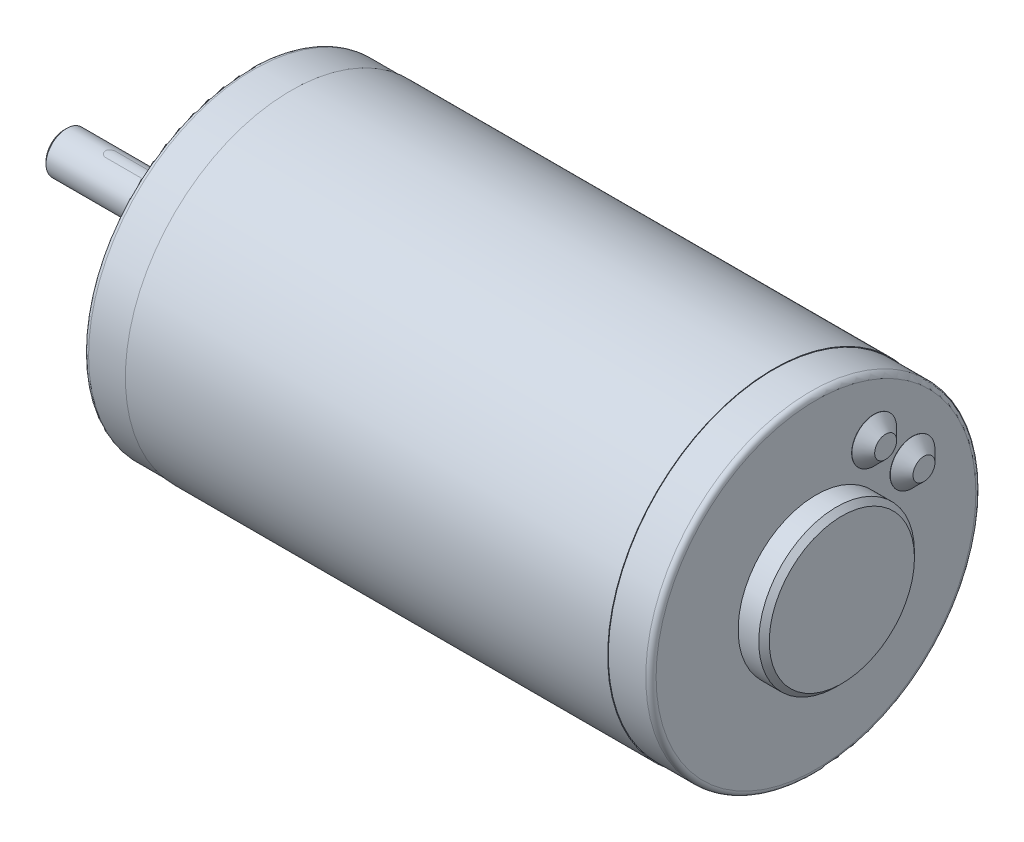
ISO-10303-21;
HEADER;
FILE_DESCRIPTION(('STEP AP214'),'2;1');
FILE_NAME('part.step','',(''),(''),'','','');
FILE_SCHEMA(('AUTOMOTIVE_DESIGN { 1 0 10303 214 1 1 1 1 }'));
ENDSEC;
DATA;
#1=APPLICATION_CONTEXT('core data for automotive mechanical design processes');
#2=APPLICATION_PROTOCOL_DEFINITION('international standard','automotive_design',2000,#1);
#3=PRODUCT_CONTEXT('',#1,'mechanical');
#4=PRODUCT('Part','Part','',(#3));
#5=PRODUCT_RELATED_PRODUCT_CATEGORY('part','',(#4));
#6=PRODUCT_DEFINITION_FORMATION('','',#4);
#7=PRODUCT_DEFINITION_CONTEXT('part definition',#1,'design');
#8=PRODUCT_DEFINITION('design','',#6,#7);
#9=PRODUCT_DEFINITION_SHAPE('','',#8);
#10=(LENGTH_UNIT() NAMED_UNIT(*) SI_UNIT(.MILLI.,.METRE.));
#11=(NAMED_UNIT(*) PLANE_ANGLE_UNIT() SI_UNIT($,.RADIAN.));
#12=(NAMED_UNIT(*) SI_UNIT($,.STERADIAN.) SOLID_ANGLE_UNIT());
#13=UNCERTAINTY_MEASURE_WITH_UNIT(LENGTH_MEASURE(1.E-05),#10,'distance_accuracy_value','');
#14=(GEOMETRIC_REPRESENTATION_CONTEXT(3) GLOBAL_UNCERTAINTY_ASSIGNED_CONTEXT((#13)) GLOBAL_UNIT_ASSIGNED_CONTEXT((#10,
#11,#12)) REPRESENTATION_CONTEXT('',''));
#15=CARTESIAN_POINT('',(0.,0.,0.));
#16=DIRECTION('',(0.,0.,1.));
#17=DIRECTION('',(1.,0.,0.));
#18=AXIS2_PLACEMENT_3D('',#15,#16,#17);
#19=CARTESIAN_POINT('',(-4.,0.,0.));
#20=DIRECTION('',(-1.,0.,0.));
#21=DIRECTION('',(0.,0.,1.));
#22=AXIS2_PLACEMENT_3D('',#19,#20,#21);
#23=PLANE('',#22);
#24=CARTESIAN_POINT('',(-4.,0.,0.));
#25=DIRECTION('',(-1.,0.,0.));
#26=DIRECTION('',(0.,0.,1.));
#27=AXIS2_PLACEMENT_3D('',#24,#25,#26);
#28=CIRCLE('',#27,8.50900000000004);
#29=CARTESIAN_POINT('',(-4.,0.,8.50900000000004));
#30=VERTEX_POINT('',#29);
#31=EDGE_CURVE('P0_E195',#30,#30,#28,.T.);
#32=ORIENTED_EDGE('',*,*,#31,.T.);
#33=EDGE_LOOP('',(#32));
#34=FACE_BOUND('',#33,.T.);
#35=CARTESIAN_POINT('',(-4.,0.,0.));
#36=DIRECTION('',(-1.,0.,0.));
#37=DIRECTION('',(0.,0.,1.));
#38=AXIS2_PLACEMENT_3D('',#35,#36,#37);
#39=CIRCLE('',#38,4.);
#40=CARTESIAN_POINT('',(-4.,0.,4.));
#41=VERTEX_POINT('',#40);
#42=EDGE_CURVE('P0_E121',#41,#41,#39,.T.);
#43=ORIENTED_EDGE('',*,*,#42,.F.);
#44=EDGE_LOOP('',(#43));
#45=FACE_BOUND('',#44,.T.);
#46=ADVANCED_FACE('P0_F38',(#34,#45),#23,.T.);
#47=CARTESIAN_POINT('',(0.,0.,0.));
#48=DIRECTION('',(-1.,0.,0.));
#49=DIRECTION('',(0.,0.,1.));
#50=AXIS2_PLACEMENT_3D('',#47,#48,#49);
#51=PLANE('',#50);
#52=CARTESIAN_POINT('',(0.,0.,0.));
#53=DIRECTION('',(-1.,0.,0.));
#54=DIRECTION('',(0.,0.,1.));
#55=AXIS2_PLACEMENT_3D('',#52,#53,#54);
#56=CIRCLE('',#55,30.877);
#57=CARTESIAN_POINT('',(0.,0.,30.877));
#58=VERTEX_POINT('',#57);
#59=EDGE_CURVE('P0_E46',#58,#58,#56,.T.);
#60=ORIENTED_EDGE('',*,*,#59,.T.);
#61=EDGE_LOOP('',(#60));
#62=FACE_BOUND('',#61,.T.);
#63=CARTESIAN_POINT('',(0.,25.4,0.));
#64=DIRECTION('',(-1.,0.,0.));
#65=DIRECTION('',(0.,0.,1.));
#66=AXIS2_PLACEMENT_3D('',#63,#64,#65);
#67=CIRCLE('',#66,2.01929999999999);
#68=CARTESIAN_POINT('',(0.,25.4,2.01929999999999));
#69=VERTEX_POINT('',#68);
#70=EDGE_CURVE('P0_E95',#69,#69,#67,.T.);
#71=ORIENTED_EDGE('',*,*,#70,.F.);
#72=EDGE_LOOP('',(#71));
#73=FACE_BOUND('',#72,.T.);
#74=CARTESIAN_POINT('',(0.,-25.4,0.));
#75=DIRECTION('',(-1.,0.,0.));
#76=DIRECTION('',(0.,0.,1.));
#77=AXIS2_PLACEMENT_3D('',#74,#75,#76);
#78=CIRCLE('',#77,2.01929999999999);
#79=CARTESIAN_POINT('',(0.,-25.4,2.01929999999999));
#80=VERTEX_POINT('',#79);
#81=EDGE_CURVE('P0_E94',#80,#80,#78,.T.);
#82=ORIENTED_EDGE('',*,*,#81,.F.);
#83=EDGE_LOOP('',(#82));
#84=FACE_BOUND('',#83,.T.);
#85=CARTESIAN_POINT('',(0.,0.,0.));
#86=DIRECTION('',(-1.,0.,0.));
#87=DIRECTION('',(0.,0.,1.));
#88=AXIS2_PLACEMENT_3D('',#85,#86,#87);
#89=CIRCLE('',#88,9.525);
#90=CARTESIAN_POINT('',(0.,0.,9.525));
#91=VERTEX_POINT('',#90);
#92=EDGE_CURVE('P0_E165',#91,#91,#89,.T.);
#93=ORIENTED_EDGE('',*,*,#92,.F.);
#94=EDGE_LOOP('',(#93));
#95=FACE_BOUND('',#94,.T.);
#96=ADVANCED_FACE('P0_F215',(#62,#73,#84,#95),#51,.T.);
#97=CARTESIAN_POINT('',(8.2296,32.004,0.));
#98=DIRECTION('',(-1.,0.,0.));
#99=DIRECTION('',(0.,0.,1.));
#100=AXIS2_PLACEMENT_3D('',#97,#98,#99);
#101=PLANE('',#100);
#102=CARTESIAN_POINT('',(8.2296,0.,0.));
#103=DIRECTION('',(1.,0.,0.));
#104=DIRECTION('',(0.,0.,-1.));
#105=AXIS2_PLACEMENT_3D('',#102,#103,#104);
#106=CIRCLE('',#105,32.004);
#107=CARTESIAN_POINT('',(8.2296,0.,-32.004));
#108=VERTEX_POINT('',#107);
#109=EDGE_CURVE('P0_E186',#108,#108,#106,.T.);
#110=ORIENTED_EDGE('',*,*,#109,.F.);
#111=EDGE_LOOP('',(#110));
#112=FACE_BOUND('',#111,.T.);
#113=CARTESIAN_POINT('',(8.2296,0.,0.));
#114=DIRECTION('',(-1.,0.,0.));
#115=DIRECTION('',(0.,0.,1.));
#116=AXIS2_PLACEMENT_3D('',#113,#114,#115);
#117=CIRCLE('',#116,31.877);
#118=CARTESIAN_POINT('',(8.2296,0.,31.877));
#119=VERTEX_POINT('',#118);
#120=EDGE_CURVE('P0_E168',#119,#119,#117,.T.);
#121=ORIENTED_EDGE('',*,*,#120,.F.);
#122=EDGE_LOOP('',(#121));
#123=FACE_BOUND('',#122,.T.);
#124=ADVANCED_FACE('P0_F233',(#112,#123),#101,.T.);
#125=CARTESIAN_POINT('',(109.6,0.,0.));
#126=DIRECTION('',(1.,0.,0.));
#127=DIRECTION('',(0.,0.,-1.));
#128=AXIS2_PLACEMENT_3D('',#125,#126,#127);
#129=PLANE('',#128);
#130=CARTESIAN_POINT('',(109.6,0.,0.));
#131=DIRECTION('',(1.,0.,0.));
#132=DIRECTION('',(0.,0.,-1.));
#133=AXIS2_PLACEMENT_3D('',#130,#131,#132);
#134=CIRCLE('',#133,30.877);
#135=CARTESIAN_POINT('',(109.6,0.,-30.877));
#136=VERTEX_POINT('',#135);
#137=EDGE_CURVE('P0_E207',#136,#136,#134,.T.);
#138=ORIENTED_EDGE('',*,*,#137,.T.);
#139=EDGE_LOOP('',(#138));
#140=FACE_BOUND('',#139,.T.);
#141=CARTESIAN_POINT('',(109.6,18.6070906828553,-11.2073596390943));
#142=DIRECTION('',(1.,0.,0.));
#143=DIRECTION('',(0.,0.,-1.));
#144=AXIS2_PLACEMENT_3D('',#141,#142,#143);
#145=CIRCLE('',#144,4.318);
#146=CARTESIAN_POINT('',(109.6,18.6070906828553,-15.5253596390943));
#147=VERTEX_POINT('',#146);
#148=EDGE_CURVE('P0_E192',#147,#147,#145,.T.);
#149=ORIENTED_EDGE('',*,*,#148,.F.);
#150=EDGE_LOOP('',(#149));
#151=FACE_BOUND('',#150,.T.);
#152=CARTESIAN_POINT('',(109.6,11.2073596390943,-18.6070906828553));
#153=DIRECTION('',(1.,0.,0.));
#154=DIRECTION('',(0.,0.,-1.));
#155=AXIS2_PLACEMENT_3D('',#152,#153,#154);
#156=CIRCLE('',#155,4.318);
#157=CARTESIAN_POINT('',(109.6,11.2073596390943,-22.9250906828553));
#158=VERTEX_POINT('',#157);
#159=EDGE_CURVE('P0_E189',#158,#158,#156,.T.);
#160=ORIENTED_EDGE('',*,*,#159,.F.);
#161=EDGE_LOOP('',(#160));
#162=FACE_BOUND('',#161,.T.);
#163=CARTESIAN_POINT('',(109.6,0.,0.));
#164=DIRECTION('',(1.,0.,0.));
#165=DIRECTION('',(0.,0.,-1.));
#166=AXIS2_PLACEMENT_3D('',#163,#164,#165);
#167=CIRCLE('',#166,15.0368);
#168=CARTESIAN_POINT('',(109.6,0.,-15.0368));
#169=VERTEX_POINT('',#168);
#170=EDGE_CURVE('P0_E174',#169,#169,#167,.T.);
#171=ORIENTED_EDGE('',*,*,#170,.F.);
#172=EDGE_LOOP('',(#171));
#173=FACE_BOUND('',#172,.T.);
#174=ADVANCED_FACE('P0_F261',(#140,#151,#162,#173),#129,.T.);
#175=CARTESIAN_POINT('',(101.3704,0.,0.));
#176=DIRECTION('',(1.,0.,0.));
#177=DIRECTION('',(0.,0.,-1.));
#178=AXIS2_PLACEMENT_3D('',#175,#176,#177);
#179=PLANE('',#178);
#180=CARTESIAN_POINT('',(101.3704,0.,0.));
#181=DIRECTION('',(1.,0.,0.));
#182=DIRECTION('',(0.,0.,-1.));
#183=AXIS2_PLACEMENT_3D('',#180,#181,#182);
#184=CIRCLE('',#183,32.004);
#185=CARTESIAN_POINT('',(101.3704,0.,-32.004));
#186=VERTEX_POINT('',#185);
#187=EDGE_CURVE('P0_E183',#186,#186,#184,.T.);
#188=ORIENTED_EDGE('',*,*,#187,.T.);
#189=EDGE_LOOP('',(#188));
#190=FACE_BOUND('',#189,.T.);
#191=CARTESIAN_POINT('',(101.3704,0.,0.));
#192=DIRECTION('',(1.,0.,0.));
#193=DIRECTION('',(0.,0.,-1.));
#194=AXIS2_PLACEMENT_3D('',#191,#192,#193);
#195=CIRCLE('',#194,31.877);
#196=CARTESIAN_POINT('',(101.3704,0.,-31.877));
#197=VERTEX_POINT('',#196);
#198=EDGE_CURVE('P0_E178',#197,#197,#195,.T.);
#199=ORIENTED_EDGE('',*,*,#198,.F.);
#200=EDGE_LOOP('',(#199));
#201=FACE_BOUND('',#200,.T.);
#202=ADVANCED_FACE('P0_F264',(#190,#201),#179,.T.);
#203=CARTESIAN_POINT('',(8.2296,0.,0.));
#204=DIRECTION('',(1.,0.,0.));
#205=DIRECTION('',(0.,0.,-1.));
#206=AXIS2_PLACEMENT_3D('',#203,#204,#205);
#207=CYLINDRICAL_SURFACE('',#206,32.004);
#208=ORIENTED_EDGE('',*,*,#109,.T.);
#209=EDGE_LOOP('',(#208));
#210=FACE_BOUND('',#209,.T.);
#211=ORIENTED_EDGE('',*,*,#187,.F.);
#212=EDGE_LOOP('',(#211));
#213=FACE_BOUND('',#212,.T.);
#214=ADVANCED_FACE('P0_F268',(#210,#213),#207,.T.);
#215=CARTESIAN_POINT('',(109.6,0.,0.));
#216=DIRECTION('',(-1.,0.,0.));
#217=DIRECTION('',(0.,0.,1.));
#218=AXIS2_PLACEMENT_3D('',#215,#216,#217);
#219=CYLINDRICAL_SURFACE('',#218,31.877);
#220=CARTESIAN_POINT('',(108.6,0.,0.));
#221=DIRECTION('',(1.,0.,0.));
#222=DIRECTION('',(0.,0.,-1.));
#223=AXIS2_PLACEMENT_3D('',#220,#221,#222);
#224=CIRCLE('',#223,31.877);
#225=CARTESIAN_POINT('',(108.6,0.,-31.877));
#226=VERTEX_POINT('',#225);
#227=EDGE_CURVE('P0_E210',#226,#226,#224,.F.);
#228=ORIENTED_EDGE('',*,*,#227,.T.);
#229=EDGE_LOOP('',(#228));
#230=FACE_BOUND('',#229,.T.);
#231=ORIENTED_EDGE('',*,*,#198,.T.);
#232=EDGE_LOOP('',(#231));
#233=FACE_BOUND('',#232,.T.);
#234=ADVANCED_FACE('P0_F259',(#230,#233),#219,.T.);
#235=CARTESIAN_POINT('',(113.584,0.,0.));
#236=DIRECTION('',(-1.,0.,0.));
#237=DIRECTION('',(0.,0.,1.));
#238=AXIS2_PLACEMENT_3D('',#235,#236,#237);
#239=CYLINDRICAL_SURFACE('',#238,15.0368);
#240=CARTESIAN_POINT('',(113.584,0.,0.));
#241=DIRECTION('',(1.,0.,0.));
#242=DIRECTION('',(0.,0.,-1.));
#243=AXIS2_PLACEMENT_3D('',#240,#241,#242);
#244=CIRCLE('',#243,15.0368);
#245=CARTESIAN_POINT('',(113.584,0.,-15.0368));
#246=VERTEX_POINT('',#245);
#247=EDGE_CURVE('P0_E175',#246,#246,#244,.T.);
#248=ORIENTED_EDGE('',*,*,#247,.F.);
#249=EDGE_LOOP('',(#248));
#250=FACE_BOUND('',#249,.T.);
#251=ORIENTED_EDGE('',*,*,#170,.T.);
#252=EDGE_LOOP('',(#251));
#253=FACE_BOUND('',#252,.T.);
#254=ADVANCED_FACE('P0_F255',(#250,#253),#239,.T.);
#255=CARTESIAN_POINT('',(113.584,0.,0.));
#256=DIRECTION('',(-1.,0.,0.));
#257=DIRECTION('',(0.,0.,-1.));
#258=AXIS2_PLACEMENT_3D('',#255,#256,#257);
#259=CONICAL_SURFACE('',#258,15.0368,0.785398163397437);
#260=CARTESIAN_POINT('',(114.6,0.,0.));
#261=DIRECTION('',(1.,0.,0.));
#262=DIRECTION('',(0.,0.,-1.));
#263=AXIS2_PLACEMENT_3D('',#260,#261,#262);
#264=CIRCLE('',#263,14.0208);
#265=CARTESIAN_POINT('',(114.6,0.,-14.0208));
#266=VERTEX_POINT('',#265);
#267=EDGE_CURVE('P0_E171',#266,#266,#264,.T.);
#268=ORIENTED_EDGE('',*,*,#267,.F.);
#269=EDGE_LOOP('',(#268));
#270=FACE_BOUND('',#269,.T.);
#271=ORIENTED_EDGE('',*,*,#247,.T.);
#272=EDGE_LOOP('',(#271));
#273=FACE_BOUND('',#272,.T.);
#274=ADVANCED_FACE('P0_F251',(#270,#273),#259,.T.);
#275=CARTESIAN_POINT('',(114.6,0.,0.));
#276=DIRECTION('',(1.,0.,0.));
#277=DIRECTION('',(0.,0.,-1.));
#278=AXIS2_PLACEMENT_3D('',#275,#276,#277);
#279=PLANE('',#278);
#280=ORIENTED_EDGE('',*,*,#267,.T.);
#281=EDGE_LOOP('',(#280));
#282=FACE_BOUND('',#281,.T.);
#283=ADVANCED_FACE('P0_F247',(#282),#279,.T.);
#284=CARTESIAN_POINT('',(0.,0.,0.));
#285=DIRECTION('',(1.,0.,0.));
#286=DIRECTION('',(0.,0.,-1.));
#287=AXIS2_PLACEMENT_3D('',#284,#285,#286);
#288=CYLINDRICAL_SURFACE('',#287,31.877);
#289=CARTESIAN_POINT('',(0.999999999999998,0.,0.));
#290=DIRECTION('',(-1.,0.,0.));
#291=DIRECTION('',(0.,0.,1.));
#292=AXIS2_PLACEMENT_3D('',#289,#290,#291);
#293=CIRCLE('',#292,31.877);
#294=CARTESIAN_POINT('',(0.999999999999998,0.,31.877));
#295=VERTEX_POINT('',#294);
#296=EDGE_CURVE('P0_E11',#295,#295,#293,.F.);
#297=ORIENTED_EDGE('',*,*,#296,.T.);
#298=EDGE_LOOP('',(#297));
#299=FACE_BOUND('',#298,.T.);
#300=ORIENTED_EDGE('',*,*,#120,.T.);
#301=EDGE_LOOP('',(#300));
#302=FACE_BOUND('',#301,.T.);
#303=ADVANCED_FACE('P0_F242',(#299,#302),#288,.T.);
#304=CARTESIAN_POINT('',(-4.,0.,0.));
#305=DIRECTION('',(1.,0.,0.));
#306=DIRECTION('',(0.,0.,-1.));
#307=AXIS2_PLACEMENT_3D('',#304,#305,#306);
#308=CYLINDRICAL_SURFACE('',#307,9.525);
#309=CARTESIAN_POINT('',(-2.98400000000005,0.,0.));
#310=DIRECTION('',(-1.,0.,0.));
#311=DIRECTION('',(0.,0.,1.));
#312=AXIS2_PLACEMENT_3D('',#309,#310,#311);
#313=CIRCLE('',#312,9.525);
#314=CARTESIAN_POINT('',(-2.98400000000005,0.,9.525));
#315=VERTEX_POINT('',#314);
#316=EDGE_CURVE('P0_E198',#315,#315,#313,.F.);
#317=ORIENTED_EDGE('',*,*,#316,.T.);
#318=EDGE_LOOP('',(#317));
#319=FACE_BOUND('',#318,.T.);
#320=ORIENTED_EDGE('',*,*,#92,.T.);
#321=EDGE_LOOP('',(#320));
#322=FACE_BOUND('',#321,.T.);
#323=ADVANCED_FACE('P0_F240',(#319,#322),#308,.T.);
#324=CARTESIAN_POINT('',(-35.6,0.,0.));
#325=DIRECTION('',(1.,0.,0.));
#326=DIRECTION('',(0.,0.,-1.));
#327=AXIS2_PLACEMENT_3D('',#324,#325,#326);
#328=CYLINDRICAL_SURFACE('',#327,4.);
#329=CARTESIAN_POINT('',(-35.099999999993,0.,0.));
#330=DIRECTION('',(-1.,0.,0.));
#331=DIRECTION('',(0.,0.,1.));
#332=AXIS2_PLACEMENT_3D('',#329,#330,#331);
#333=CIRCLE('',#332,4.);
#334=CARTESIAN_POINT('',(-35.099999999993,0.,4.));
#335=VERTEX_POINT('',#334);
#336=EDGE_CURVE('P0_E204',#335,#335,#333,.F.);
#337=ORIENTED_EDGE('',*,*,#336,.T.);
#338=EDGE_LOOP('',(#337));
#339=FACE_BOUND('',#338,.T.);
#340=DIRECTION('',(1.,0.,0.));
#341=VECTOR('',#340,1.);
#342=CARTESIAN_POINT('',(0.,3.87298334620741,-1.));
#343=LINE('',#342,#341);
#344=CARTESIAN_POINT('',(-26.6,3.87298334620741,-1.));
#345=VERTEX_POINT('',#344);
#346=CARTESIAN_POINT('',(-7.1,3.87298334620741,-1.));
#347=VERTEX_POINT('',#346);
#348=EDGE_CURVE('P0_E140',#345,#347,#343,.T.);
#349=ORIENTED_EDGE('',*,*,#348,.T.);
#350=CARTESIAN_POINT('',(-7.1,3.87298334620741,-1.));
#351=CARTESIAN_POINT('',(-7.07233701489346,3.87298148580177,-1.00000033749611));
#352=CARTESIAN_POINT('',(-7.04468773698177,3.8732800994947,-0.998851407375366));
#353=CARTESIAN_POINT('',(-6.98959596469644,3.87445904774558,-0.994271295395754));
#354=CARTESIAN_POINT('',(-6.96215343631291,3.87533928441687,-0.990840497572679));
#355=CARTESIAN_POINT('',(-6.88054682679116,3.87881710972053,-0.977175239382526));
#356=CARTESIAN_POINT('',(-6.82694353151779,3.88225203148808,-0.963567695172493));
#357=CARTESIAN_POINT('',(-6.72287532621804,3.89095422588002,-0.927798076247997));
#358=CARTESIAN_POINT('',(-6.67241012178714,3.89622132630929,-0.905636805423836));
#359=CARTESIAN_POINT('',(-6.57588855135267,3.90799134471939,-0.853415378025865));
#360=CARTESIAN_POINT('',(-6.52983337210904,3.91449459395647,-0.823353103356933));
#361=CARTESIAN_POINT('',(-6.4424561180939,3.92816262398025,-0.755484471828069));
#362=CARTESIAN_POINT('',(-6.40124511375448,3.93533791028915,-0.717537268783976));
#363=CARTESIAN_POINT('',(-6.32569791051729,3.94945104396193,-0.63527578051623));
#364=CARTESIAN_POINT('',(-6.29136281053206,3.95638885322537,-0.590960479478831));
#365=CARTESIAN_POINT('',(-6.23008899838136,3.96936182283248,-0.496456899401691));
#366=CARTESIAN_POINT('',(-6.20326010401603,3.9753830468173,-0.446195340334474));
#367=CARTESIAN_POINT('',(-6.1584752658033,3.98572346250588,-0.341702590842919));
#368=CARTESIAN_POINT('',(-6.14051757570017,3.990042989147,-0.28747218408301));
#369=CARTESIAN_POINT('',(-6.11434100722257,3.99641900005128,-0.17774410852516));
#370=CARTESIAN_POINT('',(-6.10593232757718,3.998519529013,-0.122294322002858));
#371=CARTESIAN_POINT('',(-6.09849662845671,4.00037438150815,-0.0107327756816796));
#372=CARTESIAN_POINT('',(-6.09946842980766,4.00012899993444,0.0453789000287057));
#373=CARTESIAN_POINT('',(-6.11062996368545,3.99735237365735,0.155352492972096));
#374=CARTESIAN_POINT('',(-6.12061461659948,3.9948719867736,0.209236701739855));
#375=CARTESIAN_POINT('',(-6.14918867918275,3.98796330636495,0.31453871108434));
#376=CARTESIAN_POINT('',(-6.16777846956858,3.98353492665556,0.365956402423988));
#377=CARTESIAN_POINT('',(-6.21320128067065,3.97314997761798,0.465407286024539));
#378=CARTESIAN_POINT('',(-6.24010739423284,3.96717993827555,0.513405629602248));
#379=CARTESIAN_POINT('',(-6.30134312983347,3.95435945541919,0.604276631230014));
#380=CARTESIAN_POINT('',(-6.33567387025322,3.94750887933198,0.647148515562289));
#381=CARTESIAN_POINT('',(-6.41187891208131,3.93345566022865,0.72776938970849));
#382=CARTESIAN_POINT('',(-6.45393163653981,3.92624850477685,0.765349103054127));
#383=CARTESIAN_POINT('',(-6.54382986692773,3.91246168284006,0.832969575186237));
#384=CARTESIAN_POINT('',(-6.59167695328356,3.90588218842993,0.863008270245062));
#385=CARTESIAN_POINT('',(-6.69214559782377,3.89407813586325,0.914804709285962));
#386=CARTESIAN_POINT('',(-6.74479146489609,3.88886106009136,0.936517017887269));
#387=CARTESIAN_POINT('',(-6.85311692841829,3.88047058807055,0.970702351849829));
#388=CARTESIAN_POINT('',(-6.90879185514984,3.87729413761435,0.983189189212132));
#389=CARTESIAN_POINT('',(-6.9874573807589,3.87455290681524,0.993904635150938));
#390=CARTESIAN_POINT('',(-7.00991970321318,3.87396523110859,0.996190790966708));
#391=CARTESIAN_POINT('',(-7.05491778990932,3.87318062488974,0.999236757697394));
#392=CARTESIAN_POINT('',(-7.07745337595529,3.87298306219461,0.999999038096045));
#393=CARTESIAN_POINT('',(-7.1,3.87298334620741,1.));
#394=B_SPLINE_CURVE_WITH_KNOTS('',3,(#350,#351,#352,#353,#354,#355,#356,#357,#358,#359,#360,
#361,#362,#363,#364,#365,#366,#367,#368,#369,#370,#371,#372,#373,#374,#375,#376,#377,#378,#379,
#380,#381,#382,#383,#384,#385,#386,#387,#388,#389,#390,#391,#392,#393),.UNSPECIFIED.,.F.,.F.,(4,
2,2,2,2,2,2,2,2,2,2,2,2,2,2,2,2,2,2,2,2,4),(0.,0.0829365303397693,0.165859106084651,
0.331229963080317,0.496585282091498,0.661984974726749,0.830641897427974,0.999325753539193,
1.17036187098235,1.34136430732424,1.50890481515325,1.67642426256639,1.84022545479276,
2.00403389475838,2.16932509450376,2.33464120964329,2.50441429534542,2.67423379180967,
2.84496720161068,3.01544447539986,3.08315848722648,3.15076267731671),.UNSPECIFIED.);
#395=CARTESIAN_POINT('',(-7.1,3.87298334620741,1.));
#396=VERTEX_POINT('',#395);
#397=EDGE_CURVE('P0_E117',#347,#396,#394,.T.);
#398=ORIENTED_EDGE('',*,*,#397,.T.);
#399=DIRECTION('',(1.,0.,0.));
#400=VECTOR('',#399,1.);
#401=CARTESIAN_POINT('',(0.,3.87298334620741,1.));
#402=LINE('',#401,#400);
#403=CARTESIAN_POINT('',(-26.6,3.87298334620741,1.));
#404=VERTEX_POINT('',#403);
#405=EDGE_CURVE('P0_E155',#396,#404,#402,.F.);
#406=ORIENTED_EDGE('',*,*,#405,.T.);
#407=CARTESIAN_POINT('',(-26.6,3.87298334620741,1.));
#408=CARTESIAN_POINT('',(-26.6276629851065,3.87298148580177,1.00000033749611));
#409=CARTESIAN_POINT('',(-26.6553122630182,3.8732800994947,0.998851407375366));
#410=CARTESIAN_POINT('',(-26.7104040353036,3.87445904774558,0.994271295395754));
#411=CARTESIAN_POINT('',(-26.7378465636871,3.87533928441687,0.990840497572679));
#412=CARTESIAN_POINT('',(-26.8194531732088,3.87881710972053,0.977175239382526));
#413=CARTESIAN_POINT('',(-26.8730564684822,3.88225203148808,0.963567695172493));
#414=CARTESIAN_POINT('',(-26.977124673782,3.89095422588002,0.927798076247996));
#415=CARTESIAN_POINT('',(-27.0275898782129,3.89622132630929,0.905636805423835));
#416=CARTESIAN_POINT('',(-27.1241114486473,3.90799134471939,0.853415378025864));
#417=CARTESIAN_POINT('',(-27.170166627891,3.91449459395647,0.823353103356932));
#418=CARTESIAN_POINT('',(-27.2575438819061,3.92816262398025,0.755484471828069));
#419=CARTESIAN_POINT('',(-27.2987548862455,3.93533791028915,0.717537268783975));
#420=CARTESIAN_POINT('',(-27.3743020894827,3.94945104396193,0.635275780516229));
#421=CARTESIAN_POINT('',(-27.4086371894679,3.95638885322537,0.59096047947883));
#422=CARTESIAN_POINT('',(-27.4699110016186,3.96936182283248,0.496456899401689));
#423=CARTESIAN_POINT('',(-27.496739895984,3.9753830468173,0.446195340334472));
#424=CARTESIAN_POINT('',(-27.5415247341967,3.98572346250588,0.341702590842916));
#425=CARTESIAN_POINT('',(-27.5594824242998,3.990042989147,0.287472184083007));
#426=CARTESIAN_POINT('',(-27.5856589927774,3.99641900005128,0.177744108525158));
#427=CARTESIAN_POINT('',(-27.5940676724228,3.998519529013,0.122294322002856));
#428=CARTESIAN_POINT('',(-27.6015033715433,4.00037438150815,0.0107327756816781));
#429=CARTESIAN_POINT('',(-27.6005315701923,4.00012899993444,-0.0453789000287067));
#430=CARTESIAN_POINT('',(-27.5893700363146,3.99735237365735,-0.155352492972096));
#431=CARTESIAN_POINT('',(-27.5793853834005,3.9948719867736,-0.209236701739855));
#432=CARTESIAN_POINT('',(-27.5508113208173,3.98796330636495,-0.31453871108434));
#433=CARTESIAN_POINT('',(-27.5322215304314,3.98353492665556,-0.365956402423988));
#434=CARTESIAN_POINT('',(-27.4867987193294,3.97314997761798,-0.46540728602454));
#435=CARTESIAN_POINT('',(-27.4598926057672,3.96717993827555,-0.513405629602248));
#436=CARTESIAN_POINT('',(-27.3986568701665,3.95435945541919,-0.604276631230015));
#437=CARTESIAN_POINT('',(-27.3643261297468,3.94750887933198,-0.64714851556229));
#438=CARTESIAN_POINT('',(-27.2881210879187,3.93345566022865,-0.727769389708492));
#439=CARTESIAN_POINT('',(-27.2460683634602,3.92624850477685,-0.765349103054128));
#440=CARTESIAN_POINT('',(-27.1561701330723,3.91246168284006,-0.832969575186237));
#441=CARTESIAN_POINT('',(-27.1083230467164,3.90588218842993,-0.863008270245062));
#442=CARTESIAN_POINT('',(-27.0078544021762,3.89407813586325,-0.914804709285961));
#443=CARTESIAN_POINT('',(-26.9552085351039,3.88886106009136,-0.936517017887269));
#444=CARTESIAN_POINT('',(-26.8468830715817,3.88047058807054,-0.970702351849828));
#445=CARTESIAN_POINT('',(-26.7912081448502,3.87729413761435,-0.983189189212131));
#446=CARTESIAN_POINT('',(-26.7125426192411,3.87455290681524,-0.993904635150938));
#447=CARTESIAN_POINT('',(-26.6900802967868,3.87396523110859,-0.996190790966708));
#448=CARTESIAN_POINT('',(-26.6450822100907,3.87318062488974,-0.999236757697394));
#449=CARTESIAN_POINT('',(-26.6225466240447,3.87298306219461,-0.999999038096045));
#450=CARTESIAN_POINT('',(-26.6,3.87298334620741,-1.));
#451=B_SPLINE_CURVE_WITH_KNOTS('',3,(#407,#408,#409,#410,#411,#412,#413,#414,#415,#416,#417,
#418,#419,#420,#421,#422,#423,#424,#425,#426,#427,#428,#429,#430,#431,#432,#433,#434,#435,#436,
#437,#438,#439,#440,#441,#442,#443,#444,#445,#446,#447,#448,#449,#450),.UNSPECIFIED.,.F.,.F.,(4,
2,2,2,2,2,2,2,2,2,2,2,2,2,2,2,2,2,2,2,2,4),(0.,0.0829365303397727,0.165859106084653,
0.331229963080318,0.496585282091499,0.661984974726751,0.830641897427976,0.999325753539196,
1.17036187098235,1.34136430732425,1.50890481515325,1.67642426256639,1.84022545479276,
2.00403389475838,2.16932509450376,2.33464120964329,2.50441429534542,2.67423379180967,
2.84496720161068,3.01544447539986,3.08315848722649,3.15076267731671),.UNSPECIFIED.);
#452=EDGE_CURVE('P0_E53',#404,#345,#451,.T.);
#453=ORIENTED_EDGE('',*,*,#452,.T.);
#454=EDGE_LOOP('',(#349,#398,#406,#453));
#455=FACE_BOUND('',#454,.T.);
#456=ORIENTED_EDGE('',*,*,#42,.T.);
#457=EDGE_LOOP('',(#456));
#458=FACE_BOUND('',#457,.T.);
#459=ADVANCED_FACE('P0_F238',(#339,#455,#458),#328,.T.);
#460=CARTESIAN_POINT('',(-35.6,0.,0.));
#461=DIRECTION('',(-1.,0.,0.));
#462=DIRECTION('',(0.,0.,1.));
#463=AXIS2_PLACEMENT_3D('',#460,#461,#462);
#464=PLANE('',#463);
#465=CARTESIAN_POINT('',(-35.6,0.,0.));
#466=DIRECTION('',(-1.,0.,0.));
#467=DIRECTION('',(0.,0.,1.));
#468=AXIS2_PLACEMENT_3D('',#465,#466,#467);
#469=CIRCLE('',#468,3.49999999993619);
#470=CARTESIAN_POINT('',(-35.6,0.,3.49999999993619));
#471=VERTEX_POINT('',#470);
#472=EDGE_CURVE('P0_E201',#471,#471,#469,.T.);
#473=ORIENTED_EDGE('',*,*,#472,.T.);
#474=EDGE_LOOP('',(#473));
#475=FACE_BOUND('',#474,.T.);
#476=ADVANCED_FACE('P0_F291',(#475),#464,.T.);
#477=CARTESIAN_POINT('',(-7.1,32.005,0.));
#478=DIRECTION('',(0.,-1.,0.));
#479=DIRECTION('',(0.,0.,-1.));
#480=AXIS2_PLACEMENT_3D('',#477,#478,#479);
#481=CYLINDRICAL_SURFACE('',#480,1.);
#482=ORIENTED_EDGE('',*,*,#397,.F.);
#483=DIRECTION('',(0.,-1.,0.));
#484=VECTOR('',#483,1.);
#485=CARTESIAN_POINT('',(-7.1,32.005,-1.));
#486=LINE('',#485,#484);
#487=CARTESIAN_POINT('',(-7.1,2.79999999999999,-1.));
#488=VERTEX_POINT('',#487);
#489=EDGE_CURVE('P0_E139',#347,#488,#486,.T.);
#490=ORIENTED_EDGE('',*,*,#489,.T.);
#491=CARTESIAN_POINT('',(-7.1,2.79999999999999,0.));
#492=DIRECTION('',(0.,-1.,0.));
#493=DIRECTION('',(0.,0.,-1.));
#494=AXIS2_PLACEMENT_3D('',#491,#492,#493);
#495=CIRCLE('',#494,1.);
#496=CARTESIAN_POINT('',(-7.1,2.79999999999999,1.));
#497=VERTEX_POINT('',#496);
#498=EDGE_CURVE('P0_E128',#488,#497,#495,.T.);
#499=ORIENTED_EDGE('',*,*,#498,.T.);
#500=DIRECTION('',(0.,-1.,0.));
#501=VECTOR('',#500,1.);
#502=CARTESIAN_POINT('',(-7.1,32.005,1.));
#503=LINE('',#502,#501);
#504=EDGE_CURVE('P0_E61',#396,#497,#503,.T.);
#505=ORIENTED_EDGE('',*,*,#504,.F.);
#506=EDGE_LOOP('',(#482,#490,#499,#505));
#507=FACE_BOUND('',#506,.T.);
#508=ADVANCED_FACE('P0_F293',(#507),#481,.F.);
#509=CARTESIAN_POINT('',(-26.6,32.005,-1.));
#510=DIRECTION('',(0.,0.,-1.));
#511=DIRECTION('',(-1.,0.,0.));
#512=AXIS2_PLACEMENT_3D('',#509,#510,#511);
#513=PLANE('',#512);
#514=ORIENTED_EDGE('',*,*,#348,.F.);
#515=DIRECTION('',(0.,-1.,0.));
#516=VECTOR('',#515,1.);
#517=CARTESIAN_POINT('',(-26.6,32.005,-1.));
#518=LINE('',#517,#516);
#519=CARTESIAN_POINT('',(-26.6,2.79999999999999,-1.));
#520=VERTEX_POINT('',#519);
#521=EDGE_CURVE('P0_E138',#345,#520,#518,.T.);
#522=ORIENTED_EDGE('',*,*,#521,.T.);
#523=DIRECTION('',(1.,0.,0.));
#524=VECTOR('',#523,1.);
#525=CARTESIAN_POINT('',(-26.6,2.79999999999999,-1.));
#526=LINE('',#525,#524);
#527=EDGE_CURVE('P0_E118',#520,#488,#526,.T.);
#528=ORIENTED_EDGE('',*,*,#527,.T.);
#529=ORIENTED_EDGE('',*,*,#489,.F.);
#530=EDGE_LOOP('',(#514,#522,#528,#529));
#531=FACE_BOUND('',#530,.T.);
#532=ADVANCED_FACE('P0_F298',(#531),#513,.F.);
#533=CARTESIAN_POINT('',(-26.6,32.005,0.));
#534=DIRECTION('',(0.,-1.,0.));
#535=DIRECTION('',(0.,0.,-1.));
#536=AXIS2_PLACEMENT_3D('',#533,#534,#535);
#537=CYLINDRICAL_SURFACE('',#536,1.);
#538=ORIENTED_EDGE('',*,*,#452,.F.);
#539=DIRECTION('',(0.,-1.,0.));
#540=VECTOR('',#539,1.);
#541=CARTESIAN_POINT('',(-26.6,32.005,1.));
#542=LINE('',#541,#540);
#543=CARTESIAN_POINT('',(-26.6,2.79999999999999,1.));
#544=VERTEX_POINT('',#543);
#545=EDGE_CURVE('P0_E130',#404,#544,#542,.T.);
#546=ORIENTED_EDGE('',*,*,#545,.T.);
#547=CARTESIAN_POINT('',(-26.6,2.79999999999999,0.));
#548=DIRECTION('',(0.,-1.,0.));
#549=DIRECTION('',(0.,0.,-1.));
#550=AXIS2_PLACEMENT_3D('',#547,#548,#549);
#551=CIRCLE('',#550,1.);
#552=EDGE_CURVE('P0_E122',#544,#520,#551,.T.);
#553=ORIENTED_EDGE('',*,*,#552,.T.);
#554=ORIENTED_EDGE('',*,*,#521,.F.);
#555=EDGE_LOOP('',(#538,#546,#553,#554));
#556=FACE_BOUND('',#555,.T.);
#557=ADVANCED_FACE('P0_F304',(#556),#537,.F.);
#558=CARTESIAN_POINT('',(-7.1,32.005,1.));
#559=DIRECTION('',(0.,0.,1.));
#560=DIRECTION('',(1.,0.,0.));
#561=AXIS2_PLACEMENT_3D('',#558,#559,#560);
#562=PLANE('',#561);
#563=ORIENTED_EDGE('',*,*,#405,.F.);
#564=ORIENTED_EDGE('',*,*,#504,.T.);
#565=DIRECTION('',(-1.,0.,0.));
#566=VECTOR('',#565,1.);
#567=CARTESIAN_POINT('',(-7.1,2.79999999999999,1.));
#568=LINE('',#567,#566);
#569=EDGE_CURVE('P0_E125',#497,#544,#568,.T.);
#570=ORIENTED_EDGE('',*,*,#569,.T.);
#571=ORIENTED_EDGE('',*,*,#545,.F.);
#572=EDGE_LOOP('',(#563,#564,#570,#571));
#573=FACE_BOUND('',#572,.T.);
#574=ADVANCED_FACE('P0_F307',(#573),#562,.F.);
#575=CARTESIAN_POINT('',(-7.1,2.79999999999999,0.));
#576=DIRECTION('',(0.,-1.,0.));
#577=DIRECTION('',(0.,0.,-1.));
#578=AXIS2_PLACEMENT_3D('',#575,#576,#577);
#579=PLANE('',#578);
#580=ORIENTED_EDGE('',*,*,#498,.F.);
#581=ORIENTED_EDGE('',*,*,#527,.F.);
#582=ORIENTED_EDGE('',*,*,#552,.F.);
#583=ORIENTED_EDGE('',*,*,#569,.F.);
#584=EDGE_LOOP('',(#580,#581,#582,#583));
#585=FACE_BOUND('',#584,.T.);
#586=ADVANCED_FACE('P0_F309',(#585),#579,.F.);
#587=CARTESIAN_POINT('',(109.6,11.2073596390943,-18.6070906828553));
#588=DIRECTION('',(1.,0.,0.));
#589=DIRECTION('',(0.,0.,-1.));
#590=AXIS2_PLACEMENT_3D('',#587,#588,#589);
#591=CYLINDRICAL_SURFACE('',#590,4.318);
#592=ORIENTED_EDGE('',*,*,#159,.T.);
#593=EDGE_LOOP('',(#592));
#594=FACE_BOUND('',#593,.T.);
#595=CARTESIAN_POINT('',(109.6479,11.2073596390943,-18.6070906828553));
#596=DIRECTION('',(1.,0.,0.));
#597=DIRECTION('',(0.,0.,-1.));
#598=AXIS2_PLACEMENT_3D('',#595,#596,#597);
#599=CIRCLE('',#598,4.318);
#600=CARTESIAN_POINT('',(109.6479,11.2073596390943,-22.9250906828553));
#601=VERTEX_POINT('',#600);
#602=EDGE_CURVE('P0_E111',#601,#601,#599,.T.);
#603=ORIENTED_EDGE('',*,*,#602,.F.);
#604=EDGE_LOOP('',(#603));
#605=FACE_BOUND('',#604,.T.);
#606=ADVANCED_FACE('P0_F314',(#594,#605),#591,.T.);
#607=CARTESIAN_POINT('',(111.847899999964,11.2073596390943,-18.6070906828553));
#608=DIRECTION('',(1.,0.,0.));
#609=DIRECTION('',(0.,0.,-1.));
#610=AXIS2_PLACEMENT_3D('',#607,#608,#609);
#611=PLANE('',#610);
#612=CARTESIAN_POINT('',(111.847899999964,11.2073596390943,-18.6070906828553));
#613=DIRECTION('',(1.,0.,0.));
#614=DIRECTION('',(0.,0.,-1.));
#615=AXIS2_PLACEMENT_3D('',#612,#613,#614);
#616=CIRCLE('',#615,2.11800000003618);
#617=CARTESIAN_POINT('',(111.847899999964,11.2073596390943,-20.7250906828915));
#618=VERTEX_POINT('',#617);
#619=EDGE_CURVE('P0_E114',#618,#618,#616,.T.);
#620=ORIENTED_EDGE('',*,*,#619,.T.);
#621=EDGE_LOOP('',(#620));
#622=FACE_BOUND('',#621,.T.);
#623=ADVANCED_FACE('P0_F337',(#622),#611,.T.);
#624=CARTESIAN_POINT('',(111.847899999964,11.2073596390943,-18.6070906828553));
#625=DIRECTION('',(-1.,0.,0.));
#626=DIRECTION('',(0.,0.,1.));
#627=AXIS2_PLACEMENT_3D('',#624,#625,#626);
#628=CONICAL_SURFACE('',#627,2.11800000003618,0.78539816339745);
#629=ORIENTED_EDGE('',*,*,#602,.T.);
#630=EDGE_LOOP('',(#629));
#631=FACE_BOUND('',#630,.T.);
#632=ORIENTED_EDGE('',*,*,#619,.F.);
#633=EDGE_LOOP('',(#632));
#634=FACE_BOUND('',#633,.T.);
#635=ADVANCED_FACE('P0_F343',(#631,#634),#628,.T.);
#636=CARTESIAN_POINT('',(109.6,18.6070906828553,-11.2073596390943));
#637=DIRECTION('',(1.,0.,0.));
#638=DIRECTION('',(0.,0.,-1.));
#639=AXIS2_PLACEMENT_3D('',#636,#637,#638);
#640=CYLINDRICAL_SURFACE('',#639,4.318);
#641=ORIENTED_EDGE('',*,*,#148,.T.);
#642=EDGE_LOOP('',(#641));
#643=FACE_BOUND('',#642,.T.);
#644=CARTESIAN_POINT('',(109.6479,18.6070906828553,-11.2073596390943));
#645=DIRECTION('',(1.,0.,0.));
#646=DIRECTION('',(0.,0.,-1.));
#647=AXIS2_PLACEMENT_3D('',#644,#645,#646);
#648=CIRCLE('',#647,4.318);
#649=CARTESIAN_POINT('',(109.6479,18.6070906828553,-15.5253596390943));
#650=VERTEX_POINT('',#649);
#651=EDGE_CURVE('P0_E105',#650,#650,#648,.T.);
#652=ORIENTED_EDGE('',*,*,#651,.F.);
#653=EDGE_LOOP('',(#652));
#654=FACE_BOUND('',#653,.T.);
#655=ADVANCED_FACE('P0_F347',(#643,#654),#640,.T.);
#656=CARTESIAN_POINT('',(111.847899999949,18.6070906828553,-11.2073596390943));
#657=DIRECTION('',(1.,0.,0.));
#658=DIRECTION('',(0.,0.,-1.));
#659=AXIS2_PLACEMENT_3D('',#656,#657,#658);
#660=PLANE('',#659);
#661=CARTESIAN_POINT('',(111.847899999949,18.6070906828553,-11.2073596390943));
#662=DIRECTION('',(1.,0.,0.));
#663=DIRECTION('',(0.,0.,-1.));
#664=AXIS2_PLACEMENT_3D('',#661,#662,#663);
#665=CIRCLE('',#664,2.11800000005086);
#666=CARTESIAN_POINT('',(111.847899999949,18.6070906828553,-13.3253596391452));
#667=VERTEX_POINT('',#666);
#668=EDGE_CURVE('P0_E108',#667,#667,#665,.T.);
#669=ORIENTED_EDGE('',*,*,#668,.T.);
#670=EDGE_LOOP('',(#669));
#671=FACE_BOUND('',#670,.T.);
#672=ADVANCED_FACE('P0_F351',(#671),#660,.T.);
#673=CARTESIAN_POINT('',(111.847899999949,18.6070906828553,-11.2073596390943));
#674=DIRECTION('',(-1.,0.,0.));
#675=DIRECTION('',(0.,0.,1.));
#676=AXIS2_PLACEMENT_3D('',#673,#674,#675);
#677=CONICAL_SURFACE('',#676,2.11800000005086,0.785398163397448);
#678=ORIENTED_EDGE('',*,*,#651,.T.);
#679=EDGE_LOOP('',(#678));
#680=FACE_BOUND('',#679,.T.);
#681=ORIENTED_EDGE('',*,*,#668,.F.);
#682=EDGE_LOOP('',(#681));
#683=FACE_BOUND('',#682,.T.);
#684=ADVANCED_FACE('P0_F355',(#680,#683),#677,.T.);
#685=CARTESIAN_POINT('',(13.6144,-25.4,0.));
#686=DIRECTION('',(-1.,0.,0.));
#687=DIRECTION('',(0.,0.,1.));
#688=AXIS2_PLACEMENT_3D('',#685,#686,#687);
#689=CONICAL_SURFACE('',#688,2.01929999999999,1.02974425867198);
#690=CARTESIAN_POINT('',(14.8277178480152,-25.4,0.));
#691=VERTEX_POINT('',#690);
#692=VERTEX_LOOP('',#691);
#693=FACE_BOUND('',#692,.T.);
#694=CARTESIAN_POINT('',(13.6144,-25.4,0.));
#695=DIRECTION('',(-1.,0.,0.));
#696=DIRECTION('',(0.,0.,1.));
#697=AXIS2_PLACEMENT_3D('',#694,#695,#696);
#698=CIRCLE('',#697,2.01929999999999);
#699=CARTESIAN_POINT('',(13.6144,-25.4,2.01929999999999));
#700=VERTEX_POINT('',#699);
#701=EDGE_CURVE('P0_E98',#700,#700,#698,.T.);
#702=ORIENTED_EDGE('',*,*,#701,.T.);
#703=EDGE_LOOP('',(#702));
#704=FACE_BOUND('',#703,.T.);
#705=ADVANCED_FACE('P0_F359',(#693,#704),#689,.F.);
#706=CARTESIAN_POINT('',(0.,-25.4,0.));
#707=DIRECTION('',(-1.,0.,0.));
#708=DIRECTION('',(0.,0.,1.));
#709=AXIS2_PLACEMENT_3D('',#706,#707,#708);
#710=CYLINDRICAL_SURFACE('',#709,2.01929999999999);
#711=ORIENTED_EDGE('',*,*,#701,.F.);
#712=EDGE_LOOP('',(#711));
#713=FACE_BOUND('',#712,.T.);
#714=ORIENTED_EDGE('',*,*,#81,.T.);
#715=EDGE_LOOP('',(#714));
#716=FACE_BOUND('',#715,.T.);
#717=ADVANCED_FACE('P0_F88',(#713,#716),#710,.F.);
#718=CARTESIAN_POINT('',(13.6144,25.4,0.));
#719=DIRECTION('',(-1.,0.,0.));
#720=DIRECTION('',(0.,0.,1.));
#721=AXIS2_PLACEMENT_3D('',#718,#719,#720);
#722=CONICAL_SURFACE('',#721,2.01929999999999,1.02974425867198);
#723=CARTESIAN_POINT('',(14.8277178480152,25.4,0.));
#724=VERTEX_POINT('',#723);
#725=VERTEX_LOOP('',#724);
#726=FACE_BOUND('',#725,.T.);
#727=CARTESIAN_POINT('',(13.6144,25.4,0.));
#728=DIRECTION('',(-1.,0.,0.));
#729=DIRECTION('',(0.,0.,1.));
#730=AXIS2_PLACEMENT_3D('',#727,#728,#729);
#731=CIRCLE('',#730,2.01929999999999);
#732=CARTESIAN_POINT('',(13.6144,25.4,2.01929999999999));
#733=VERTEX_POINT('',#732);
#734=EDGE_CURVE('P0_E92',#733,#733,#731,.T.);
#735=ORIENTED_EDGE('',*,*,#734,.T.);
#736=EDGE_LOOP('',(#735));
#737=FACE_BOUND('',#736,.T.);
#738=ADVANCED_FACE('P0_F84',(#726,#737),#722,.F.);
#739=CARTESIAN_POINT('',(0.,25.4,0.));
#740=DIRECTION('',(-1.,0.,0.));
#741=DIRECTION('',(0.,0.,1.));
#742=AXIS2_PLACEMENT_3D('',#739,#740,#741);
#743=CYLINDRICAL_SURFACE('',#742,2.01929999999999);
#744=ORIENTED_EDGE('',*,*,#734,.F.);
#745=EDGE_LOOP('',(#744));
#746=FACE_BOUND('',#745,.T.);
#747=ORIENTED_EDGE('',*,*,#70,.T.);
#748=EDGE_LOOP('',(#747));
#749=FACE_BOUND('',#748,.T.);
#750=ADVANCED_FACE('P0_F87',(#746,#749),#743,.F.);
#751=CARTESIAN_POINT('',(-4.,0.,0.));
#752=DIRECTION('',(1.,0.,0.));
#753=DIRECTION('',(0.,0.,-1.));
#754=AXIS2_PLACEMENT_3D('',#751,#752,#753);
#755=CONICAL_SURFACE('',#754,8.50900000000004,0.785398163397452);
#756=ORIENTED_EDGE('',*,*,#316,.F.);
#757=EDGE_LOOP('',(#756));
#758=FACE_BOUND('',#757,.T.);
#759=ORIENTED_EDGE('',*,*,#31,.F.);
#760=EDGE_LOOP('',(#759));
#761=FACE_BOUND('',#760,.T.);
#762=ADVANCED_FACE('P0_F279',(#758,#761),#755,.T.);
#763=CARTESIAN_POINT('',(-35.6,0.,0.));
#764=DIRECTION('',(1.,0.,0.));
#765=DIRECTION('',(0.,0.,-1.));
#766=AXIS2_PLACEMENT_3D('',#763,#764,#765);
#767=CONICAL_SURFACE('',#766,3.49999999993619,0.785398163454277);
#768=ORIENTED_EDGE('',*,*,#336,.F.);
#769=EDGE_LOOP('',(#768));
#770=FACE_BOUND('',#769,.T.);
#771=ORIENTED_EDGE('',*,*,#472,.F.);
#772=EDGE_LOOP('',(#771));
#773=FACE_BOUND('',#772,.T.);
#774=ADVANCED_FACE('P0_F224',(#770,#773),#767,.T.);
#775=CARTESIAN_POINT('',(108.6,0.,0.));
#776=DIRECTION('',(1.,0.,0.));
#777=DIRECTION('',(0.,0.,-1.));
#778=AXIS2_PLACEMENT_3D('',#775,#776,#777);
#779=TOROIDAL_SURFACE('',#778,30.877,1.);
#780=ORIENTED_EDGE('',*,*,#227,.F.);
#781=EDGE_LOOP('',(#780));
#782=FACE_BOUND('',#781,.T.);
#783=ORIENTED_EDGE('',*,*,#137,.F.);
#784=EDGE_LOOP('',(#783));
#785=FACE_BOUND('',#784,.T.);
#786=ADVANCED_FACE('P0_F219',(#782,#785),#779,.T.);
#787=CARTESIAN_POINT('',(0.999999999999998,0.,0.));
#788=DIRECTION('',(-1.,0.,0.));
#789=DIRECTION('',(0.,0.,1.));
#790=AXIS2_PLACEMENT_3D('',#787,#788,#789);
#791=TOROIDAL_SURFACE('',#790,30.877,1.);
#792=ORIENTED_EDGE('',*,*,#296,.F.);
#793=EDGE_LOOP('',(#792));
#794=FACE_BOUND('',#793,.T.);
#795=ORIENTED_EDGE('',*,*,#59,.F.);
#796=EDGE_LOOP('',(#795));
#797=FACE_BOUND('',#796,.T.);
#798=ADVANCED_FACE('P0_F40',(#794,#797),#791,.T.);
#799=CLOSED_SHELL('',(#46,#96,#124,#174,#202,#214,#234,#254,#274,#283,#303,#323,#459,#476,#508,
#532,#557,#574,#586,#606,#623,#635,#655,#672,#684,#705,#717,#738,#750,#762,#774,#786,#798));
#800=MANIFOLD_SOLID_BREP('P0_B2',#799);
#801=CARTESIAN_POINT('',(0.,0.,0.));
#802=DIRECTION('',(1.,0.,0.));
#803=DIRECTION('',(0.,0.,-1.));
#804=AXIS2_PLACEMENT_3D('',#801,#802,#803);
#805=CYLINDRICAL_SURFACE('',#804,4.);
#806=DIRECTION('',(1.,0.,0.));
#807=VECTOR('',#806,1.);
#808=CARTESIAN_POINT('',(0.,3.87298334620741,1.));
#809=LINE('',#808,#807);
#810=CARTESIAN_POINT('',(-7.1,3.87298334620741,1.));
#811=VERTEX_POINT('',#810);
#812=CARTESIAN_POINT('',(-26.6,3.87298334620741,1.));
#813=VERTEX_POINT('',#812);
#814=EDGE_CURVE('P1_E30',#811,#813,#809,.F.);
#815=ORIENTED_EDGE('',*,*,#814,.F.);
#816=CARTESIAN_POINT('',(-7.1,3.87298334620741,-1.));
#817=CARTESIAN_POINT('',(-7.07233701489346,3.87298148580177,-1.00000033749611));
#818=CARTESIAN_POINT('',(-7.04468773698177,3.8732800994947,-0.998851407375366));
#819=CARTESIAN_POINT('',(-6.98959596469644,3.87445904774558,-0.994271295395754));
#820=CARTESIAN_POINT('',(-6.96215343631291,3.87533928441687,-0.990840497572679));
#821=CARTESIAN_POINT('',(-6.88054682679116,3.87881710972053,-0.977175239382526));
#822=CARTESIAN_POINT('',(-6.82694353151779,3.88225203148808,-0.963567695172493));
#823=CARTESIAN_POINT('',(-6.72287532621804,3.89095422588002,-0.927798076247997));
#824=CARTESIAN_POINT('',(-6.67241012178714,3.89622132630929,-0.905636805423836));
#825=CARTESIAN_POINT('',(-6.57588855135267,3.90799134471939,-0.853415378025865));
#826=CARTESIAN_POINT('',(-6.52983337210904,3.91449459395647,-0.823353103356933));
#827=CARTESIAN_POINT('',(-6.4424561180939,3.92816262398025,-0.755484471828069));
#828=CARTESIAN_POINT('',(-6.40124511375448,3.93533791028915,-0.717537268783976));
#829=CARTESIAN_POINT('',(-6.32569791051729,3.94945104396193,-0.63527578051623));
#830=CARTESIAN_POINT('',(-6.29136281053206,3.95638885322537,-0.590960479478831));
#831=CARTESIAN_POINT('',(-6.23008899838136,3.96936182283248,-0.496456899401691));
#832=CARTESIAN_POINT('',(-6.20326010401603,3.9753830468173,-0.446195340334474));
#833=CARTESIAN_POINT('',(-6.1584752658033,3.98572346250588,-0.341702590842919));
#834=CARTESIAN_POINT('',(-6.14051757570017,3.990042989147,-0.28747218408301));
#835=CARTESIAN_POINT('',(-6.11434100722257,3.99641900005128,-0.17774410852516));
#836=CARTESIAN_POINT('',(-6.10593232757718,3.998519529013,-0.122294322002858));
#837=CARTESIAN_POINT('',(-6.09849662845671,4.00037438150815,-0.0107327756816796));
#838=CARTESIAN_POINT('',(-6.09946842980766,4.00012899993444,0.0453789000287057));
#839=CARTESIAN_POINT('',(-6.11062996368545,3.99735237365735,0.155352492972096));
#840=CARTESIAN_POINT('',(-6.12061461659948,3.9948719867736,0.209236701739855));
#841=CARTESIAN_POINT('',(-6.14918867918275,3.98796330636495,0.31453871108434));
#842=CARTESIAN_POINT('',(-6.16777846956858,3.98353492665556,0.365956402423988));
#843=CARTESIAN_POINT('',(-6.21320128067065,3.97314997761798,0.465407286024539));
#844=CARTESIAN_POINT('',(-6.24010739423284,3.96717993827555,0.513405629602248));
#845=CARTESIAN_POINT('',(-6.30134312983347,3.95435945541919,0.604276631230014));
#846=CARTESIAN_POINT('',(-6.33567387025322,3.94750887933198,0.647148515562289));
#847=CARTESIAN_POINT('',(-6.41187891208131,3.93345566022865,0.72776938970849));
#848=CARTESIAN_POINT('',(-6.45393163653981,3.92624850477685,0.765349103054127));
#849=CARTESIAN_POINT('',(-6.54382986692773,3.91246168284006,0.832969575186237));
#850=CARTESIAN_POINT('',(-6.59167695328356,3.90588218842993,0.863008270245062));
#851=CARTESIAN_POINT('',(-6.69214559782377,3.89407813586325,0.914804709285962));
#852=CARTESIAN_POINT('',(-6.74479146489609,3.88886106009136,0.936517017887269));
#853=CARTESIAN_POINT('',(-6.85311692841829,3.88047058807055,0.970702351849829));
#854=CARTESIAN_POINT('',(-6.90879185514984,3.87729413761435,0.983189189212132));
#855=CARTESIAN_POINT('',(-6.9874573807589,3.87455290681524,0.993904635150938));
#856=CARTESIAN_POINT('',(-7.00991970321318,3.87396523110859,0.996190790966708));
#857=CARTESIAN_POINT('',(-7.05491778990932,3.87318062488974,0.999236757697394));
#858=CARTESIAN_POINT('',(-7.07745337595529,3.87298306219461,0.999999038096045));
#859=CARTESIAN_POINT('',(-7.1,3.87298334620741,1.));
#860=B_SPLINE_CURVE_WITH_KNOTS('',3,(#816,#817,#818,#819,#820,#821,#822,#823,#824,#825,#826,
#827,#828,#829,#830,#831,#832,#833,#834,#835,#836,#837,#838,#839,#840,#841,#842,#843,#844,#845,
#846,#847,#848,#849,#850,#851,#852,#853,#854,#855,#856,#857,#858,#859),.UNSPECIFIED.,.F.,.F.,(4,
2,2,2,2,2,2,2,2,2,2,2,2,2,2,2,2,2,2,2,2,4),(0.,0.0829365303397693,0.165859106084651,
0.331229963080317,0.496585282091498,0.661984974726749,0.830641897427974,0.999325753539193,
1.17036187098235,1.34136430732424,1.50890481515325,1.67642426256639,1.84022545479276,
2.00403389475838,2.16932509450376,2.33464120964329,2.50441429534542,2.67423379180967,
2.84496720161068,3.01544447539986,3.08315848722648,3.15076267731671),.UNSPECIFIED.);
#861=CARTESIAN_POINT('',(-7.1,3.87298334620741,-1.));
#862=VERTEX_POINT('',#861);
#863=EDGE_CURVE('P1_E41',#862,#811,#860,.T.);
#864=ORIENTED_EDGE('',*,*,#863,.F.);
#865=DIRECTION('',(1.,0.,0.));
#866=VECTOR('',#865,1.);
#867=CARTESIAN_POINT('',(0.,3.87298334620741,-1.));
#868=LINE('',#867,#866);
#869=CARTESIAN_POINT('',(-26.6,3.87298334620741,-1.));
#870=VERTEX_POINT('',#869);
#871=EDGE_CURVE('P1_E26',#870,#862,#868,.T.);
#872=ORIENTED_EDGE('',*,*,#871,.F.);
#873=CARTESIAN_POINT('',(-26.6,3.87298334620741,1.));
#874=CARTESIAN_POINT('',(-26.6276629851065,3.87298148580177,1.00000033749611));
#875=CARTESIAN_POINT('',(-26.6553122630182,3.8732800994947,0.998851407375366));
#876=CARTESIAN_POINT('',(-26.7104040353036,3.87445904774558,0.994271295395754));
#877=CARTESIAN_POINT('',(-26.7378465636871,3.87533928441687,0.990840497572679));
#878=CARTESIAN_POINT('',(-26.8194531732088,3.87881710972053,0.977175239382526));
#879=CARTESIAN_POINT('',(-26.8730564684822,3.88225203148808,0.963567695172493));
#880=CARTESIAN_POINT('',(-26.977124673782,3.89095422588002,0.927798076247996));
#881=CARTESIAN_POINT('',(-27.0275898782129,3.89622132630929,0.905636805423835));
#882=CARTESIAN_POINT('',(-27.1241114486473,3.90799134471939,0.853415378025864));
#883=CARTESIAN_POINT('',(-27.170166627891,3.91449459395647,0.823353103356932));
#884=CARTESIAN_POINT('',(-27.2575438819061,3.92816262398025,0.755484471828069));
#885=CARTESIAN_POINT('',(-27.2987548862455,3.93533791028915,0.717537268783975));
#886=CARTESIAN_POINT('',(-27.3743020894827,3.94945104396193,0.635275780516229));
#887=CARTESIAN_POINT('',(-27.4086371894679,3.95638885322537,0.59096047947883));
#888=CARTESIAN_POINT('',(-27.4699110016186,3.96936182283248,0.496456899401689));
#889=CARTESIAN_POINT('',(-27.496739895984,3.9753830468173,0.446195340334472));
#890=CARTESIAN_POINT('',(-27.5415247341967,3.98572346250588,0.341702590842916));
#891=CARTESIAN_POINT('',(-27.5594824242998,3.990042989147,0.287472184083007));
#892=CARTESIAN_POINT('',(-27.5856589927774,3.99641900005128,0.177744108525158));
#893=CARTESIAN_POINT('',(-27.5940676724228,3.998519529013,0.122294322002856));
#894=CARTESIAN_POINT('',(-27.6015033715433,4.00037438150815,0.0107327756816781));
#895=CARTESIAN_POINT('',(-27.6005315701923,4.00012899993444,-0.0453789000287067));
#896=CARTESIAN_POINT('',(-27.5893700363146,3.99735237365735,-0.155352492972096));
#897=CARTESIAN_POINT('',(-27.5793853834005,3.9948719867736,-0.209236701739855));
#898=CARTESIAN_POINT('',(-27.5508113208173,3.98796330636495,-0.31453871108434));
#899=CARTESIAN_POINT('',(-27.5322215304314,3.98353492665556,-0.365956402423988));
#900=CARTESIAN_POINT('',(-27.4867987193294,3.97314997761798,-0.46540728602454));
#901=CARTESIAN_POINT('',(-27.4598926057672,3.96717993827555,-0.513405629602248));
#902=CARTESIAN_POINT('',(-27.3986568701665,3.95435945541919,-0.604276631230015));
#903=CARTESIAN_POINT('',(-27.3643261297468,3.94750887933198,-0.64714851556229));
#904=CARTESIAN_POINT('',(-27.2881210879187,3.93345566022865,-0.727769389708492));
#905=CARTESIAN_POINT('',(-27.2460683634602,3.92624850477685,-0.765349103054128));
#906=CARTESIAN_POINT('',(-27.1561701330723,3.91246168284006,-0.832969575186237));
#907=CARTESIAN_POINT('',(-27.1083230467164,3.90588218842993,-0.863008270245062));
#908=CARTESIAN_POINT('',(-27.0078544021762,3.89407813586325,-0.914804709285961));
#909=CARTESIAN_POINT('',(-26.9552085351039,3.88886106009136,-0.936517017887269));
#910=CARTESIAN_POINT('',(-26.8468830715817,3.88047058807054,-0.970702351849828));
#911=CARTESIAN_POINT('',(-26.7912081448502,3.87729413761435,-0.983189189212131));
#912=CARTESIAN_POINT('',(-26.7125426192411,3.87455290681524,-0.993904635150938));
#913=CARTESIAN_POINT('',(-26.6900802967868,3.87396523110859,-0.996190790966708));
#914=CARTESIAN_POINT('',(-26.6450822100907,3.87318062488974,-0.999236757697394));
#915=CARTESIAN_POINT('',(-26.6225466240447,3.87298306219461,-0.999999038096045));
#916=CARTESIAN_POINT('',(-26.6,3.87298334620741,-1.));
#917=B_SPLINE_CURVE_WITH_KNOTS('',3,(#873,#874,#875,#876,#877,#878,#879,#880,#881,#882,#883,
#884,#885,#886,#887,#888,#889,#890,#891,#892,#893,#894,#895,#896,#897,#898,#899,#900,#901,#902,
#903,#904,#905,#906,#907,#908,#909,#910,#911,#912,#913,#914,#915,#916),.UNSPECIFIED.,.F.,.F.,(4,
2,2,2,2,2,2,2,2,2,2,2,2,2,2,2,2,2,2,2,2,4),(0.,0.0829365303397727,0.165859106084653,
0.331229963080318,0.496585282091499,0.661984974726751,0.830641897427976,0.999325753539196,
1.17036187098235,1.34136430732425,1.50890481515325,1.67642426256639,1.84022545479276,
2.00403389475838,2.16932509450376,2.33464120964329,2.50441429534542,2.67423379180967,
2.84496720161068,3.01544447539986,3.08315848722649,3.15076267731671),.UNSPECIFIED.);
#918=EDGE_CURVE('P1_E11',#813,#870,#917,.T.);
#919=ORIENTED_EDGE('',*,*,#918,.F.);
#920=EDGE_LOOP('',(#815,#864,#872,#919));
#921=FACE_BOUND('',#920,.T.);
#922=ADVANCED_FACE('P1_F16',(#921),#805,.T.);
#923=OPEN_SHELL('',(#922));
#924=SHELL_BASED_SURFACE_MODEL('P1_B1',(#923));
#925=ADVANCED_BREP_SHAPE_REPRESENTATION('',(#18,#800),#14);
#926=MANIFOLD_SURFACE_SHAPE_REPRESENTATION('',(#18,#924),#14);
#927=SHAPE_REPRESENTATION('',(#18),#14);
#928=SHAPE_DEFINITION_REPRESENTATION(#9,#927);
#929=SHAPE_REPRESENTATION_RELATIONSHIP('','',#927,#925);
#930=SHAPE_REPRESENTATION_RELATIONSHIP('','',#927,#926);
ENDSEC;
END-ISO-10303-21;
